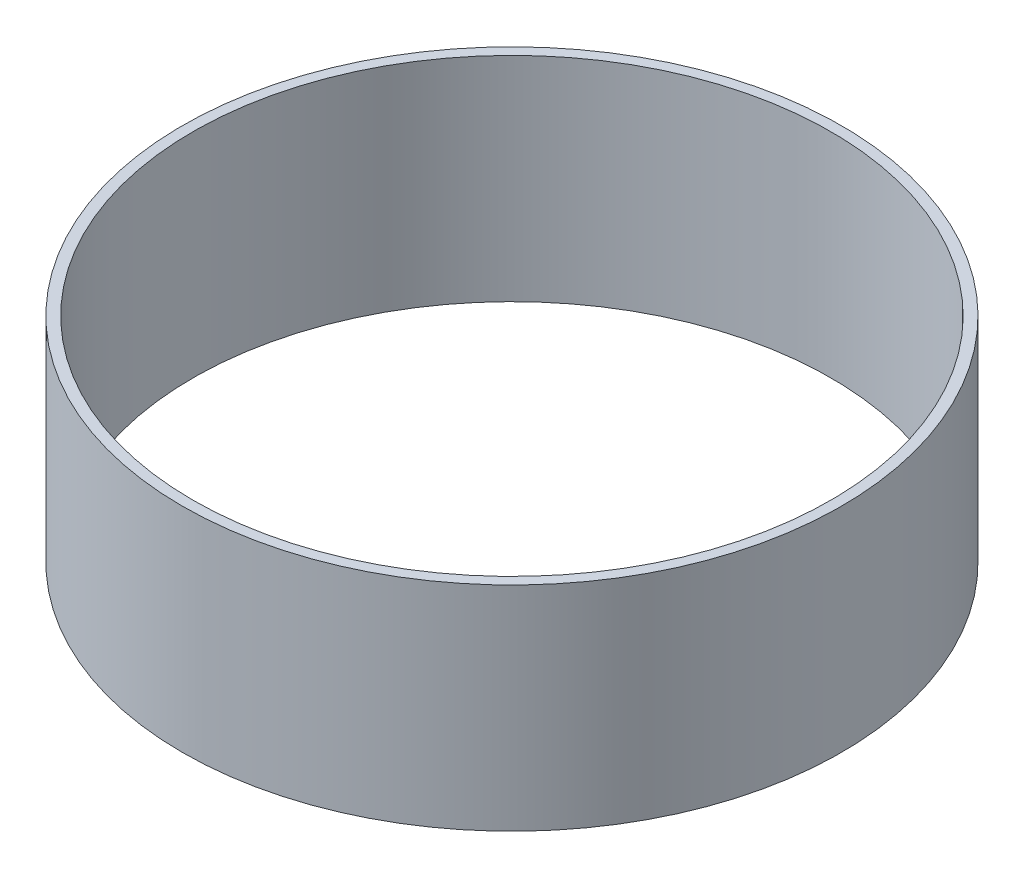
ISO-10303-21;
HEADER;
FILE_DESCRIPTION(('STEP AP214'),'2;1');
FILE_NAME('part.step','',(''),(''),'','','');
FILE_SCHEMA(('AUTOMOTIVE_DESIGN { 1 0 10303 214 1 1 1 1 }'));
ENDSEC;
DATA;
#1=APPLICATION_CONTEXT('core data for automotive mechanical design processes');
#2=APPLICATION_PROTOCOL_DEFINITION('international standard','automotive_design',2000,#1);
#3=PRODUCT_CONTEXT('',#1,'mechanical');
#4=PRODUCT('Part','Part','',(#3));
#5=PRODUCT_RELATED_PRODUCT_CATEGORY('part','',(#4));
#6=PRODUCT_DEFINITION_FORMATION('','',#4);
#7=PRODUCT_DEFINITION_CONTEXT('part definition',#1,'design');
#8=PRODUCT_DEFINITION('design','',#6,#7);
#9=PRODUCT_DEFINITION_SHAPE('','',#8);
#10=(LENGTH_UNIT() NAMED_UNIT(*) SI_UNIT(.MILLI.,.METRE.));
#11=(NAMED_UNIT(*) PLANE_ANGLE_UNIT() SI_UNIT($,.RADIAN.));
#12=(NAMED_UNIT(*) SI_UNIT($,.STERADIAN.) SOLID_ANGLE_UNIT());
#13=UNCERTAINTY_MEASURE_WITH_UNIT(LENGTH_MEASURE(1.E-05),#10,'distance_accuracy_value','');
#14=(GEOMETRIC_REPRESENTATION_CONTEXT(3) GLOBAL_UNCERTAINTY_ASSIGNED_CONTEXT((#13)) GLOBAL_UNIT_ASSIGNED_CONTEXT((#10,
#11,#12)) REPRESENTATION_CONTEXT('',''));
#15=CARTESIAN_POINT('',(0.,0.,0.));
#16=DIRECTION('',(0.,0.,1.));
#17=DIRECTION('',(1.,0.,0.));
#18=AXIS2_PLACEMENT_3D('',#15,#16,#17);
#19=CARTESIAN_POINT('',(0.,50.8,0.));
#20=DIRECTION('',(0.,1.,0.));
#21=DIRECTION('',(0.,0.,1.));
#22=AXIS2_PLACEMENT_3D('',#19,#20,#21);
#23=PLANE('',#22);
#24=CARTESIAN_POINT('',(0.,50.8,0.));
#25=DIRECTION('',(0.,1.,0.));
#26=DIRECTION('',(0.,0.,1.));
#27=AXIS2_PLACEMENT_3D('',#24,#25,#26);
#28=CIRCLE('',#27,78.5);
#29=CARTESIAN_POINT('',(0.,50.8,78.5));
#30=VERTEX_POINT('',#29);
#31=EDGE_CURVE('E10',#30,#30,#28,.T.);
#32=ORIENTED_EDGE('',*,*,#31,.T.);
#33=EDGE_LOOP('',(#32));
#34=FACE_BOUND('',#33,.T.);
#35=CARTESIAN_POINT('',(0.,50.8,0.));
#36=DIRECTION('',(0.,1.,0.));
#37=DIRECTION('',(0.,0.,1.));
#38=AXIS2_PLACEMENT_3D('',#35,#36,#37);
#39=CIRCLE('',#38,76.);
#40=CARTESIAN_POINT('',(0.,50.8,76.));
#41=VERTEX_POINT('',#40);
#42=EDGE_CURVE('E48',#41,#41,#39,.T.);
#43=ORIENTED_EDGE('',*,*,#42,.F.);
#44=EDGE_LOOP('',(#43));
#45=FACE_BOUND('',#44,.T.);
#46=ADVANCED_FACE('F37',(#34,#45),#23,.T.);
#47=CARTESIAN_POINT('',(0.,0.,0.));
#48=DIRECTION('',(0.,1.,0.));
#49=DIRECTION('',(0.,0.,1.));
#50=AXIS2_PLACEMENT_3D('',#47,#48,#49);
#51=PLANE('',#50);
#52=CARTESIAN_POINT('',(0.,0.,0.));
#53=DIRECTION('',(0.,1.,0.));
#54=DIRECTION('',(0.,0.,1.));
#55=AXIS2_PLACEMENT_3D('',#52,#53,#54);
#56=CIRCLE('',#55,78.5);
#57=CARTESIAN_POINT('',(0.,0.,78.5));
#58=VERTEX_POINT('',#57);
#59=EDGE_CURVE('E41',#58,#58,#56,.T.);
#60=ORIENTED_EDGE('',*,*,#59,.F.);
#61=EDGE_LOOP('',(#60));
#62=FACE_BOUND('',#61,.T.);
#63=CARTESIAN_POINT('',(0.,0.,0.));
#64=DIRECTION('',(0.,1.,0.));
#65=DIRECTION('',(0.,0.,1.));
#66=AXIS2_PLACEMENT_3D('',#63,#64,#65);
#67=CIRCLE('',#66,76.);
#68=CARTESIAN_POINT('',(0.,0.,76.));
#69=VERTEX_POINT('',#68);
#70=EDGE_CURVE('E50',#69,#69,#67,.T.);
#71=ORIENTED_EDGE('',*,*,#70,.T.);
#72=EDGE_LOOP('',(#71));
#73=FACE_BOUND('',#72,.T.);
#74=ADVANCED_FACE('F60',(#62,#73),#51,.F.);
#75=CARTESIAN_POINT('',(0.,50.8,0.));
#76=DIRECTION('',(0.,-1.,0.));
#77=DIRECTION('',(0.,0.,-1.));
#78=AXIS2_PLACEMENT_3D('',#75,#76,#77);
#79=CYLINDRICAL_SURFACE('',#78,78.5);
#80=ORIENTED_EDGE('',*,*,#31,.F.);
#81=EDGE_LOOP('',(#80));
#82=FACE_BOUND('',#81,.T.);
#83=ORIENTED_EDGE('',*,*,#59,.T.);
#84=EDGE_LOOP('',(#83));
#85=FACE_BOUND('',#84,.T.);
#86=ADVANCED_FACE('F39',(#82,#85),#79,.T.);
#87=CARTESIAN_POINT('',(0.,50.8,0.));
#88=DIRECTION('',(0.,-1.,0.));
#89=DIRECTION('',(0.,0.,-1.));
#90=AXIS2_PLACEMENT_3D('',#87,#88,#89);
#91=CYLINDRICAL_SURFACE('',#90,76.);
#92=ORIENTED_EDGE('',*,*,#42,.T.);
#93=EDGE_LOOP('',(#92));
#94=FACE_BOUND('',#93,.T.);
#95=ORIENTED_EDGE('',*,*,#70,.F.);
#96=EDGE_LOOP('',(#95));
#97=FACE_BOUND('',#96,.T.);
#98=ADVANCED_FACE('F56',(#94,#97),#91,.F.);
#99=CLOSED_SHELL('',(#46,#74,#86,#98));
#100=MANIFOLD_SOLID_BREP('B2',#99);
#101=ADVANCED_BREP_SHAPE_REPRESENTATION('',(#18,#100),#14);
#102=SHAPE_DEFINITION_REPRESENTATION(#9,#101);
ENDSEC;
END-ISO-10303-21;
